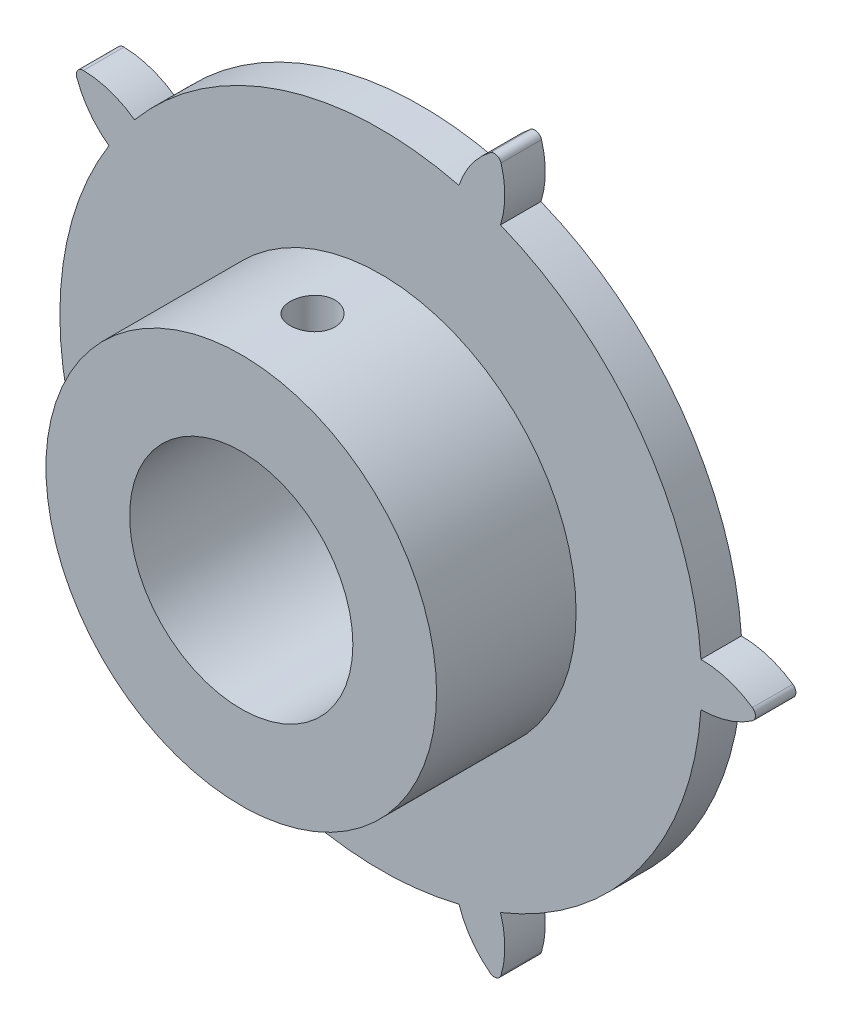
ISO-10303-21;
HEADER;
FILE_DESCRIPTION(('STEP AP214'),'2;1');
FILE_NAME('part.step','',(''),(''),'','','');
FILE_SCHEMA(('AUTOMOTIVE_DESIGN { 1 0 10303 214 1 1 1 1 }'));
ENDSEC;
DATA;
#1=APPLICATION_CONTEXT('core data for automotive mechanical design processes');
#2=APPLICATION_PROTOCOL_DEFINITION('international standard','automotive_design',2000,#1);
#3=PRODUCT_CONTEXT('',#1,'mechanical');
#4=PRODUCT('Part','Part','',(#3));
#5=PRODUCT_RELATED_PRODUCT_CATEGORY('part','',(#4));
#6=PRODUCT_DEFINITION_FORMATION('','',#4);
#7=PRODUCT_DEFINITION_CONTEXT('part definition',#1,'design');
#8=PRODUCT_DEFINITION('design','',#6,#7);
#9=PRODUCT_DEFINITION_SHAPE('','',#8);
#10=(LENGTH_UNIT() NAMED_UNIT(*) SI_UNIT(.MILLI.,.METRE.));
#11=(NAMED_UNIT(*) PLANE_ANGLE_UNIT() SI_UNIT($,.RADIAN.));
#12=(NAMED_UNIT(*) SI_UNIT($,.STERADIAN.) SOLID_ANGLE_UNIT());
#13=UNCERTAINTY_MEASURE_WITH_UNIT(LENGTH_MEASURE(1.E-05),#10,'distance_accuracy_value','');
#14=(GEOMETRIC_REPRESENTATION_CONTEXT(3) GLOBAL_UNCERTAINTY_ASSIGNED_CONTEXT((#13)) GLOBAL_UNIT_ASSIGNED_CONTEXT((#10,
#11,#12)) REPRESENTATION_CONTEXT('',''));
#15=CARTESIAN_POINT('',(0.,0.,0.));
#16=DIRECTION('',(0.,0.,1.));
#17=DIRECTION('',(1.,0.,0.));
#18=AXIS2_PLACEMENT_3D('',#15,#16,#17);
#19=CARTESIAN_POINT('',(0.,0.,1.45));
#20=DIRECTION('',(0.,0.,1.));
#21=DIRECTION('',(1.,0.,0.));
#22=AXIS2_PLACEMENT_3D('',#19,#20,#21);
#23=PLANE('',#22);
#24=CARTESIAN_POINT('',(0.,0.,1.45));
#25=DIRECTION('',(0.,0.,1.));
#26=DIRECTION('',(1.,0.,0.));
#27=AXIS2_PLACEMENT_3D('',#24,#25,#26);
#28=CIRCLE('',#27,11.5);
#29=CARTESIAN_POINT('',(11.4733978573661,0.78175546469862,1.45));
#30=VERTEX_POINT('',#29);
#31=CARTESIAN_POINT('',(4.28896855000234,10.6702740722575,1.45));
#32=VERTEX_POINT('',#31);
#33=EDGE_CURVE('E47',#30,#32,#28,.T.);
#34=ORIENTED_EDGE('',*,*,#33,.T.);
#35=CARTESIAN_POINT('',(1.18301199040116,11.6720902745467,1.45));
#36=DIRECTION('',(0.,0.,1.));
#37=DIRECTION('',(0.309016994374958,0.95105651629515,0.));
#38=AXIS2_PLACEMENT_3D('',#35,#36,#37);
#39=CIRCLE('',#38,3.26352598477457);
#40=CARTESIAN_POINT('',(4.31118696275242,12.6022102644695,1.45));
#41=VERTEX_POINT('',#40);
#42=EDGE_CURVE('E198',#32,#41,#39,.T.);
#43=ORIENTED_EDGE('',*,*,#42,.T.);
#44=CARTESIAN_POINT('',(4.07155542718742,12.5309591089508,1.45));
#45=DIRECTION('',(0.,0.,1.));
#46=DIRECTION('',(-0.309016994374958,-0.95105651629515,0.));
#47=AXIS2_PLACEMENT_3D('',#44,#45,#46);
#48=CIRCLE('',#47,0.25);
#49=CARTESIAN_POINT('',(3.9195698209499,12.7294543872236,1.45));
#50=VERTEX_POINT('',#49);
#51=EDGE_CURVE('E206',#41,#50,#48,.T.);
#52=ORIENTED_EDGE('',*,*,#51,.T.);
#53=CARTESIAN_POINT('',(5.90360572202134,10.1382763932297,1.45));
#54=DIRECTION('',(0.,0.,1.));
#55=DIRECTION('',(-0.309016994374958,-0.95105651629515,0.));
#56=AXIS2_PLACEMENT_3D('',#53,#54,#55);
#57=CIRCLE('',#56,3.26352598477458);
#58=CARTESIAN_POINT('',(2.8019812923004,11.1534255203322,1.45));
#59=VERTEX_POINT('',#58);
#60=EDGE_CURVE('E54',#50,#59,#57,.T.);
#61=ORIENTED_EDGE('',*,*,#60,.T.);
#62=CARTESIAN_POINT('',(-8.82266951678534,7.37634751063063,1.45));
#63=VERTEX_POINT('',#62);
#64=EDGE_CURVE('E315',#59,#63,#28,.T.);
#65=ORIENTED_EDGE('',*,*,#64,.T.);
#66=CARTESIAN_POINT('',(-10.7352467048097,4.73198551703978,1.45));
#67=DIRECTION('',(0.,0.,1.));
#68=DIRECTION('',(-0.809016994374942,0.58778525229248,0.));
#69=AXIS2_PLACEMENT_3D('',#66,#67,#68);
#70=CIRCLE('',#69,3.26352598477457);
#71=CARTESIAN_POINT('',(-10.6531841543272,7.99447959229986,1.45));
#72=VERTEX_POINT('',#71);
#73=EDGE_CURVE('E220',#63,#72,#70,.T.);
#74=ORIENTED_EDGE('',*,*,#73,.T.);
#75=CARTESIAN_POINT('',(-10.6594704954553,7.7445586409668,1.45));
#76=DIRECTION('',(0.,0.,1.));
#77=DIRECTION('',(0.809016994374942,-0.58778525229248,0.));
#78=AXIS2_PLACEMENT_3D('',#75,#76,#77);
#79=CIRCLE('',#78,0.25);
#80=CARTESIAN_POINT('',(-10.8952168585383,7.66135015406103,1.45));
#81=VERTEX_POINT('',#80);
#82=EDGE_CURVE('E215',#72,#81,#79,.T.);
#83=ORIENTED_EDGE('',*,*,#82,.T.);
#84=CARTESIAN_POINT('',(-7.81775933158866,8.74756239074405,1.45));
#85=DIRECTION('',(0.,0.,1.));
#86=DIRECTION('',(0.809016994374942,-0.58778525229248,0.));
#87=AXIS2_PLACEMENT_3D('',#84,#85,#86);
#88=CIRCLE('',#87,3.26352598477458);
#89=CARTESIAN_POINT('',(-9.74167818288316,6.11144059785729,1.45));
#90=VERTEX_POINT('',#89);
#91=EDGE_CURVE('E61',#81,#90,#88,.T.);
#92=ORIENTED_EDGE('',*,*,#91,.T.);
#93=CARTESIAN_POINT('',(-9.74167818288325,-6.11144059785715,1.45));
#94=VERTEX_POINT('',#93);
#95=EDGE_CURVE('E349',#90,#94,#28,.T.);
#96=ORIENTED_EDGE('',*,*,#95,.T.);
#97=CARTESIAN_POINT('',(-7.8177593315888,-8.74756239074393,1.45));
#98=DIRECTION('',(0.,0.,1.));
#99=DIRECTION('',(-0.809016994374951,-0.587785252292469,0.));
#100=AXIS2_PLACEMENT_3D('',#97,#98,#99);
#101=CIRCLE('',#100,3.26352598477457);
#102=CARTESIAN_POINT('',(-10.8952168585384,-7.66135015406087,1.45));
#103=VERTEX_POINT('',#102);
#104=EDGE_CURVE('E243',#94,#103,#101,.T.);
#105=ORIENTED_EDGE('',*,*,#104,.T.);
#106=CARTESIAN_POINT('',(-10.6594704954554,-7.74455864096665,1.45));
#107=DIRECTION('',(0.,0.,1.));
#108=DIRECTION('',(0.809016994374951,0.587785252292469,0.));
#109=AXIS2_PLACEMENT_3D('',#106,#107,#108);
#110=CIRCLE('',#109,0.25);
#111=CARTESIAN_POINT('',(-10.6531841543274,-7.99447959229971,1.45));
#112=VERTEX_POINT('',#111);
#113=EDGE_CURVE('E238',#103,#112,#110,.T.);
#114=ORIENTED_EDGE('',*,*,#113,.T.);
#115=CARTESIAN_POINT('',(-10.7352467048098,-4.73198551703962,1.45));
#116=DIRECTION('',(0.,0.,1.));
#117=DIRECTION('',(0.809016994374951,0.587785252292469,0.));
#118=AXIS2_PLACEMENT_3D('',#115,#116,#117);
#119=CIRCLE('',#118,3.26352598477458);
#120=CARTESIAN_POINT('',(-8.82266951678546,-7.37634751063049,1.45));
#121=VERTEX_POINT('',#120);
#122=EDGE_CURVE('E250',#112,#121,#119,.T.);
#123=ORIENTED_EDGE('',*,*,#122,.T.);
#124=CARTESIAN_POINT('',(2.80198129230024,-11.1534255203323,1.45));
#125=VERTEX_POINT('',#124);
#126=EDGE_CURVE('E321',#121,#125,#28,.T.);
#127=ORIENTED_EDGE('',*,*,#126,.T.);
#128=CARTESIAN_POINT('',(5.90360572202119,-10.1382763932298,1.45));
#129=DIRECTION('',(0.,0.,1.));
#130=DIRECTION('',(0.309016994374945,-0.951056516295155,0.));
#131=AXIS2_PLACEMENT_3D('',#128,#129,#130);
#132=CIRCLE('',#131,3.26352598477457);
#133=CARTESIAN_POINT('',(3.91956982094972,-12.7294543872237,1.45));
#134=VERTEX_POINT('',#133);
#135=EDGE_CURVE('E268',#125,#134,#132,.T.);
#136=ORIENTED_EDGE('',*,*,#135,.T.);
#137=CARTESIAN_POINT('',(4.07155542718724,-12.5309591089508,1.45));
#138=DIRECTION('',(0.,0.,1.));
#139=DIRECTION('',(-0.309016994374945,0.951056516295155,0.));
#140=AXIS2_PLACEMENT_3D('',#137,#138,#139);
#141=CIRCLE('',#140,0.25);
#142=CARTESIAN_POINT('',(4.31118696275224,-12.6022102644696,1.45));
#143=VERTEX_POINT('',#142);
#144=EDGE_CURVE('E263',#134,#143,#141,.T.);
#145=ORIENTED_EDGE('',*,*,#144,.T.);
#146=CARTESIAN_POINT('',(1.18301199040099,-11.6720902745468,1.45));
#147=DIRECTION('',(0.,0.,1.));
#148=DIRECTION('',(-0.309016994374945,0.951056516295155,0.));
#149=AXIS2_PLACEMENT_3D('',#146,#147,#148);
#150=CIRCLE('',#149,3.26352598477458);
#151=CARTESIAN_POINT('',(4.28896855000218,-10.6702740722576,1.45));
#152=VERTEX_POINT('',#151);
#153=EDGE_CURVE('E275',#143,#152,#150,.T.);
#154=ORIENTED_EDGE('',*,*,#153,.T.);
#155=CARTESIAN_POINT('',(11.4733978573661,-0.781755464698626,1.45));
#156=VERTEX_POINT('',#155);
#157=EDGE_CURVE('E316',#152,#156,#28,.T.);
#158=ORIENTED_EDGE('',*,*,#157,.T.);
#159=CARTESIAN_POINT('',(11.4663883239762,2.48176299238729,1.45));
#160=DIRECTION('',(0.,0.,1.));
#161=DIRECTION('',(1.,0.,0.));
#162=AXIS2_PLACEMENT_3D('',#159,#160,#161);
#163=CIRCLE('',#162,3.26352598477457);
#164=CARTESIAN_POINT('',(13.3176442291636,-0.205885315484757,1.45));
#165=VERTEX_POINT('',#164);
#166=EDGE_CURVE('E293',#156,#165,#163,.T.);
#167=ORIENTED_EDGE('',*,*,#166,.T.);
#168=CARTESIAN_POINT('',(13.1758301365362,0.,1.45));
#169=DIRECTION('',(0.,0.,1.));
#170=DIRECTION('',(-1.,0.,0.));
#171=AXIS2_PLACEMENT_3D('',#168,#169,#170);
#172=CIRCLE('',#171,0.25);
#173=CARTESIAN_POINT('',(13.3176442291636,0.205885315484755,1.45));
#174=VERTEX_POINT('',#173);
#175=EDGE_CURVE('E288',#165,#174,#172,.T.);
#176=ORIENTED_EDGE('',*,*,#175,.T.);
#177=CARTESIAN_POINT('',(11.4663883239762,-2.4817629923873,1.45));
#178=DIRECTION('',(0.,0.,1.));
#179=DIRECTION('',(-1.,0.,0.));
#180=AXIS2_PLACEMENT_3D('',#177,#178,#179);
#181=CIRCLE('',#180,3.26352598477458);
#182=EDGE_CURVE('E300',#174,#30,#181,.T.);
#183=ORIENTED_EDGE('',*,*,#182,.T.);
#184=EDGE_LOOP('',(#34,#43,#52,#61,#65,#74,#83,#92,#96,#105,#114,#123,#127,#136,#145,#154,#158,
#167,#176,#183));
#185=FACE_BOUND('',#184,.T.);
#186=CARTESIAN_POINT('',(0.,0.,1.45));
#187=DIRECTION('',(0.,0.,1.));
#188=DIRECTION('',(1.,0.,0.));
#189=AXIS2_PLACEMENT_3D('',#186,#187,#188);
#190=CIRCLE('',#189,7.);
#191=CARTESIAN_POINT('',(7.,0.,1.45));
#192=VERTEX_POINT('',#191);
#193=EDGE_CURVE('E387',#192,#192,#190,.T.);
#194=ORIENTED_EDGE('',*,*,#193,.F.);
#195=EDGE_LOOP('',(#194));
#196=FACE_BOUND('',#195,.T.);
#197=ADVANCED_FACE('F35',(#185,#196),#23,.T.);
#198=CARTESIAN_POINT('',(0.,0.,1.45));
#199=DIRECTION('',(0.,0.,-1.));
#200=DIRECTION('',(-1.,0.,0.));
#201=AXIS2_PLACEMENT_3D('',#198,#199,#200);
#202=CYLINDRICAL_SURFACE('',#201,11.5);
#203=CARTESIAN_POINT('',(0.,0.,0.));
#204=DIRECTION('',(0.,0.,1.));
#205=DIRECTION('',(1.,0.,0.));
#206=AXIS2_PLACEMENT_3D('',#203,#204,#205);
#207=CIRCLE('',#206,11.5);
#208=CARTESIAN_POINT('',(11.4733978573661,0.781755464698625,0.));
#209=VERTEX_POINT('',#208);
#210=CARTESIAN_POINT('',(4.28896855000234,10.6702740722575,0.));
#211=VERTEX_POINT('',#210);
#212=EDGE_CURVE('E317',#209,#211,#207,.T.);
#213=ORIENTED_EDGE('',*,*,#212,.T.);
#214=DIRECTION('',(0.,0.,1.));
#215=VECTOR('',#214,1.);
#216=CARTESIAN_POINT('',(4.28896855000234,10.6702740722575,0.725));
#217=LINE('',#216,#215);
#218=EDGE_CURVE('E212',#211,#32,#217,.T.);
#219=ORIENTED_EDGE('',*,*,#218,.T.);
#220=ORIENTED_EDGE('',*,*,#33,.F.);
#221=DIRECTION('',(0.,0.,1.));
#222=VECTOR('',#221,1.);
#223=CARTESIAN_POINT('',(11.4733978573661,0.781755464698625,0.725));
#224=LINE('',#223,#222);
#225=EDGE_CURVE('E306',#30,#209,#224,.F.);
#226=ORIENTED_EDGE('',*,*,#225,.T.);
#227=EDGE_LOOP('',(#213,#219,#220,#226));
#228=FACE_BOUND('',#227,.T.);
#229=ADVANCED_FACE('F363',(#228),#202,.T.);
#230=ORIENTED_EDGE('',*,*,#64,.F.);
#231=DIRECTION('',(0.,0.,1.));
#232=VECTOR('',#231,1.);
#233=CARTESIAN_POINT('',(2.8019812923004,11.1534255203322,0.725));
#234=LINE('',#233,#232);
#235=CARTESIAN_POINT('',(2.8019812923004,11.1534255203322,0.));
#236=VERTEX_POINT('',#235);
#237=EDGE_CURVE('E209',#59,#236,#234,.F.);
#238=ORIENTED_EDGE('',*,*,#237,.T.);
#239=CARTESIAN_POINT('',(-8.82266951678534,7.37634751063063,0.));
#240=VERTEX_POINT('',#239);
#241=EDGE_CURVE('E193',#236,#240,#207,.T.);
#242=ORIENTED_EDGE('',*,*,#241,.T.);
#243=DIRECTION('',(0.,0.,1.));
#244=VECTOR('',#243,1.);
#245=CARTESIAN_POINT('',(-8.82266951678534,7.37634751063063,0.725));
#246=LINE('',#245,#244);
#247=EDGE_CURVE('E235',#240,#63,#246,.T.);
#248=ORIENTED_EDGE('',*,*,#247,.T.);
#249=EDGE_LOOP('',(#230,#238,#242,#248));
#250=FACE_BOUND('',#249,.T.);
#251=ADVANCED_FACE('F364',(#250),#202,.T.);
#252=ORIENTED_EDGE('',*,*,#95,.F.);
#253=DIRECTION('',(0.,0.,1.));
#254=VECTOR('',#253,1.);
#255=CARTESIAN_POINT('',(-9.74167818288316,6.11144059785729,0.725));
#256=LINE('',#255,#254);
#257=CARTESIAN_POINT('',(-9.74167818288316,6.11144059785729,0.));
#258=VERTEX_POINT('',#257);
#259=EDGE_CURVE('E231',#90,#258,#256,.F.);
#260=ORIENTED_EDGE('',*,*,#259,.T.);
#261=CARTESIAN_POINT('',(-9.74167818288325,-6.11144059785715,0.));
#262=VERTEX_POINT('',#261);
#263=EDGE_CURVE('E322',#258,#262,#207,.T.);
#264=ORIENTED_EDGE('',*,*,#263,.T.);
#265=DIRECTION('',(0.,0.,1.));
#266=VECTOR('',#265,1.);
#267=CARTESIAN_POINT('',(-9.74167818288325,-6.11144059785715,0.725));
#268=LINE('',#267,#266);
#269=EDGE_CURVE('E260',#262,#94,#268,.T.);
#270=ORIENTED_EDGE('',*,*,#269,.T.);
#271=EDGE_LOOP('',(#252,#260,#264,#270));
#272=FACE_BOUND('',#271,.T.);
#273=ADVANCED_FACE('F334',(#272),#202,.T.);
#274=ORIENTED_EDGE('',*,*,#126,.F.);
#275=DIRECTION('',(0.,0.,1.));
#276=VECTOR('',#275,1.);
#277=CARTESIAN_POINT('',(-8.82266951678545,-7.3763475106305,0.725));
#278=LINE('',#277,#276);
#279=CARTESIAN_POINT('',(-8.82266951678545,-7.3763475106305,0.));
#280=VERTEX_POINT('',#279);
#281=EDGE_CURVE('E256',#121,#280,#278,.F.);
#282=ORIENTED_EDGE('',*,*,#281,.T.);
#283=CARTESIAN_POINT('',(2.80198129230024,-11.1534255203323,0.));
#284=VERTEX_POINT('',#283);
#285=EDGE_CURVE('E323',#280,#284,#207,.T.);
#286=ORIENTED_EDGE('',*,*,#285,.T.);
#287=DIRECTION('',(0.,0.,1.));
#288=VECTOR('',#287,1.);
#289=CARTESIAN_POINT('',(2.80198129230024,-11.1534255203323,0.725));
#290=LINE('',#289,#288);
#291=EDGE_CURVE('E285',#284,#125,#290,.T.);
#292=ORIENTED_EDGE('',*,*,#291,.T.);
#293=EDGE_LOOP('',(#274,#282,#286,#292));
#294=FACE_BOUND('',#293,.T.);
#295=ADVANCED_FACE('F357',(#294),#202,.T.);
#296=ORIENTED_EDGE('',*,*,#157,.F.);
#297=DIRECTION('',(0.,0.,1.));
#298=VECTOR('',#297,1.);
#299=CARTESIAN_POINT('',(4.28896855000219,-10.6702740722576,0.725));
#300=LINE('',#299,#298);
#301=CARTESIAN_POINT('',(4.28896855000219,-10.6702740722576,0.));
#302=VERTEX_POINT('',#301);
#303=EDGE_CURVE('E281',#152,#302,#300,.F.);
#304=ORIENTED_EDGE('',*,*,#303,.T.);
#305=CARTESIAN_POINT('',(11.4733978573661,-0.781755464698626,0.));
#306=VERTEX_POINT('',#305);
#307=EDGE_CURVE('E313',#302,#306,#207,.T.);
#308=ORIENTED_EDGE('',*,*,#307,.T.);
#309=DIRECTION('',(0.,0.,1.));
#310=VECTOR('',#309,1.);
#311=CARTESIAN_POINT('',(11.4733978573661,-0.781755464698627,0.725));
#312=LINE('',#311,#310);
#313=EDGE_CURVE('E310',#306,#156,#312,.T.);
#314=ORIENTED_EDGE('',*,*,#313,.T.);
#315=EDGE_LOOP('',(#296,#304,#308,#314));
#316=FACE_BOUND('',#315,.T.);
#317=ADVANCED_FACE('F37',(#316),#202,.T.);
#318=CARTESIAN_POINT('',(0.,0.,0.));
#319=DIRECTION('',(0.,0.,1.));
#320=DIRECTION('',(1.,0.,0.));
#321=AXIS2_PLACEMENT_3D('',#318,#319,#320);
#322=PLANE('',#321);
#323=CARTESIAN_POINT('',(0.,0.,0.));
#324=DIRECTION('',(0.,0.,1.));
#325=DIRECTION('',(1.,0.,0.));
#326=AXIS2_PLACEMENT_3D('',#323,#324,#325);
#327=CIRCLE('',#326,4.);
#328=CARTESIAN_POINT('',(4.,0.,0.));
#329=VERTEX_POINT('',#328);
#330=EDGE_CURVE('E202',#329,#329,#327,.T.);
#331=ORIENTED_EDGE('',*,*,#330,.T.);
#332=EDGE_LOOP('',(#331));
#333=FACE_BOUND('',#332,.T.);
#334=ORIENTED_EDGE('',*,*,#241,.F.);
#335=CARTESIAN_POINT('',(5.90360572202134,10.1382763932297,0.));
#336=DIRECTION('',(0.,0.,1.));
#337=DIRECTION('',(-0.309016994374958,-0.95105651629515,0.));
#338=AXIS2_PLACEMENT_3D('',#335,#336,#337);
#339=CIRCLE('',#338,3.26352598477458);
#340=CARTESIAN_POINT('',(3.9195698209499,12.7294543872236,0.));
#341=VERTEX_POINT('',#340);
#342=EDGE_CURVE('E178',#341,#236,#339,.T.);
#343=ORIENTED_EDGE('',*,*,#342,.F.);
#344=CARTESIAN_POINT('',(4.07155542718742,12.5309591089508,0.));
#345=DIRECTION('',(0.,0.,1.));
#346=DIRECTION('',(-0.309016994374958,-0.95105651629515,0.));
#347=AXIS2_PLACEMENT_3D('',#344,#345,#346);
#348=CIRCLE('',#347,0.25);
#349=CARTESIAN_POINT('',(4.31118696275242,12.6022102644695,0.));
#350=VERTEX_POINT('',#349);
#351=EDGE_CURVE('E191',#350,#341,#348,.T.);
#352=ORIENTED_EDGE('',*,*,#351,.F.);
#353=CARTESIAN_POINT('',(1.18301199040116,11.6720902745467,0.));
#354=DIRECTION('',(0.,0.,1.));
#355=DIRECTION('',(0.309016994374958,0.95105651629515,0.));
#356=AXIS2_PLACEMENT_3D('',#353,#354,#355);
#357=CIRCLE('',#356,3.26352598477457);
#358=EDGE_CURVE('E184',#211,#350,#357,.T.);
#359=ORIENTED_EDGE('',*,*,#358,.F.);
#360=ORIENTED_EDGE('',*,*,#212,.F.);
#361=CARTESIAN_POINT('',(11.4663883239762,-2.4817629923873,0.));
#362=DIRECTION('',(0.,0.,1.));
#363=DIRECTION('',(-1.,0.,0.));
#364=AXIS2_PLACEMENT_3D('',#361,#362,#363);
#365=CIRCLE('',#364,3.26352598477458);
#366=CARTESIAN_POINT('',(13.3176442291636,0.205885315484755,0.));
#367=VERTEX_POINT('',#366);
#368=EDGE_CURVE('E292',#367,#209,#365,.T.);
#369=ORIENTED_EDGE('',*,*,#368,.F.);
#370=CARTESIAN_POINT('',(13.1758301365362,0.,0.));
#371=DIRECTION('',(0.,0.,1.));
#372=DIRECTION('',(-1.,0.,0.));
#373=AXIS2_PLACEMENT_3D('',#370,#371,#372);
#374=CIRCLE('',#373,0.25);
#375=CARTESIAN_POINT('',(13.3176442291636,-0.205885315484757,0.));
#376=VERTEX_POINT('',#375);
#377=EDGE_CURVE('E289',#376,#367,#374,.T.);
#378=ORIENTED_EDGE('',*,*,#377,.F.);
#379=CARTESIAN_POINT('',(11.4663883239762,2.48176299238729,0.));
#380=DIRECTION('',(0.,0.,1.));
#381=DIRECTION('',(1.,0.,0.));
#382=AXIS2_PLACEMENT_3D('',#379,#380,#381);
#383=CIRCLE('',#382,3.26352598477457);
#384=EDGE_CURVE('E295',#306,#376,#383,.T.);
#385=ORIENTED_EDGE('',*,*,#384,.F.);
#386=ORIENTED_EDGE('',*,*,#307,.F.);
#387=CARTESIAN_POINT('',(1.18301199040099,-11.6720902745468,0.));
#388=DIRECTION('',(0.,0.,1.));
#389=DIRECTION('',(-0.309016994374945,0.951056516295155,0.));
#390=AXIS2_PLACEMENT_3D('',#387,#388,#389);
#391=CIRCLE('',#390,3.26352598477458);
#392=CARTESIAN_POINT('',(4.31118696275224,-12.6022102644696,0.));
#393=VERTEX_POINT('',#392);
#394=EDGE_CURVE('E267',#393,#302,#391,.T.);
#395=ORIENTED_EDGE('',*,*,#394,.F.);
#396=CARTESIAN_POINT('',(4.07155542718724,-12.5309591089508,0.));
#397=DIRECTION('',(0.,0.,1.));
#398=DIRECTION('',(-0.309016994374945,0.951056516295155,0.));
#399=AXIS2_PLACEMENT_3D('',#396,#397,#398);
#400=CIRCLE('',#399,0.25);
#401=CARTESIAN_POINT('',(3.91956982094972,-12.7294543872237,0.));
#402=VERTEX_POINT('',#401);
#403=EDGE_CURVE('E264',#402,#393,#400,.T.);
#404=ORIENTED_EDGE('',*,*,#403,.F.);
#405=CARTESIAN_POINT('',(5.90360572202119,-10.1382763932298,0.));
#406=DIRECTION('',(0.,0.,1.));
#407=DIRECTION('',(0.309016994374945,-0.951056516295155,0.));
#408=AXIS2_PLACEMENT_3D('',#405,#406,#407);
#409=CIRCLE('',#408,3.26352598477457);
#410=EDGE_CURVE('E270',#284,#402,#409,.T.);
#411=ORIENTED_EDGE('',*,*,#410,.F.);
#412=ORIENTED_EDGE('',*,*,#285,.F.);
#413=CARTESIAN_POINT('',(-10.7352467048098,-4.73198551703962,0.));
#414=DIRECTION('',(0.,0.,1.));
#415=DIRECTION('',(0.809016994374951,0.587785252292469,0.));
#416=AXIS2_PLACEMENT_3D('',#413,#414,#415);
#417=CIRCLE('',#416,3.26352598477458);
#418=CARTESIAN_POINT('',(-10.6531841543274,-7.99447959229971,0.));
#419=VERTEX_POINT('',#418);
#420=EDGE_CURVE('E242',#419,#280,#417,.T.);
#421=ORIENTED_EDGE('',*,*,#420,.F.);
#422=CARTESIAN_POINT('',(-10.6594704954554,-7.74455864096665,0.));
#423=DIRECTION('',(0.,0.,1.));
#424=DIRECTION('',(0.809016994374951,0.587785252292469,0.));
#425=AXIS2_PLACEMENT_3D('',#422,#423,#424);
#426=CIRCLE('',#425,0.25);
#427=CARTESIAN_POINT('',(-10.8952168585384,-7.66135015406087,0.));
#428=VERTEX_POINT('',#427);
#429=EDGE_CURVE('E239',#428,#419,#426,.T.);
#430=ORIENTED_EDGE('',*,*,#429,.F.);
#431=CARTESIAN_POINT('',(-7.8177593315888,-8.74756239074393,0.));
#432=DIRECTION('',(0.,0.,1.));
#433=DIRECTION('',(-0.809016994374951,-0.587785252292469,0.));
#434=AXIS2_PLACEMENT_3D('',#431,#432,#433);
#435=CIRCLE('',#434,3.26352598477457);
#436=EDGE_CURVE('E245',#262,#428,#435,.T.);
#437=ORIENTED_EDGE('',*,*,#436,.F.);
#438=ORIENTED_EDGE('',*,*,#263,.F.);
#439=CARTESIAN_POINT('',(-7.81775933158866,8.74756239074405,0.));
#440=DIRECTION('',(0.,0.,1.));
#441=DIRECTION('',(0.809016994374942,-0.58778525229248,0.));
#442=AXIS2_PLACEMENT_3D('',#439,#440,#441);
#443=CIRCLE('',#442,3.26352598477458);
#444=CARTESIAN_POINT('',(-10.8952168585383,7.66135015406103,0.));
#445=VERTEX_POINT('',#444);
#446=EDGE_CURVE('E219',#445,#258,#443,.T.);
#447=ORIENTED_EDGE('',*,*,#446,.F.);
#448=CARTESIAN_POINT('',(-10.6594704954553,7.7445586409668,0.));
#449=DIRECTION('',(0.,0.,1.));
#450=DIRECTION('',(0.809016994374942,-0.58778525229248,0.));
#451=AXIS2_PLACEMENT_3D('',#448,#449,#450);
#452=CIRCLE('',#451,0.25);
#453=CARTESIAN_POINT('',(-10.6531841543272,7.99447959229986,0.));
#454=VERTEX_POINT('',#453);
#455=EDGE_CURVE('E216',#454,#445,#452,.T.);
#456=ORIENTED_EDGE('',*,*,#455,.F.);
#457=CARTESIAN_POINT('',(-10.7352467048097,4.73198551703978,0.));
#458=DIRECTION('',(0.,0.,1.));
#459=DIRECTION('',(-0.809016994374942,0.58778525229248,0.));
#460=AXIS2_PLACEMENT_3D('',#457,#458,#459);
#461=CIRCLE('',#460,3.26352598477457);
#462=EDGE_CURVE('E222',#240,#454,#461,.T.);
#463=ORIENTED_EDGE('',*,*,#462,.F.);
#464=EDGE_LOOP('',(#334,#343,#352,#359,#360,#369,#378,#385,#386,#395,#404,#411,#412,#421,#430,
#437,#438,#447,#456,#463));
#465=FACE_BOUND('',#464,.T.);
#466=ADVANCED_FACE('F189',(#333,#465),#322,.F.);
#467=CARTESIAN_POINT('',(11.4663883239762,2.48176299238729,0.));
#468=DIRECTION('',(0.,0.,1.));
#469=DIRECTION('',(1.,0.,0.));
#470=AXIS2_PLACEMENT_3D('',#467,#468,#469);
#471=CYLINDRICAL_SURFACE('',#470,3.26352598477457);
#472=ORIENTED_EDGE('',*,*,#313,.F.);
#473=ORIENTED_EDGE('',*,*,#384,.T.);
#474=DIRECTION('',(0.,0.,1.));
#475=VECTOR('',#474,1.);
#476=CARTESIAN_POINT('',(13.3176442291636,-0.205885315484757,0.));
#477=LINE('',#476,#475);
#478=EDGE_CURVE('E303',#376,#165,#477,.T.);
#479=ORIENTED_EDGE('',*,*,#478,.T.);
#480=ORIENTED_EDGE('',*,*,#166,.F.);
#481=EDGE_LOOP('',(#472,#473,#479,#480));
#482=FACE_BOUND('',#481,.T.);
#483=ADVANCED_FACE('F374',(#482),#471,.T.);
#484=CARTESIAN_POINT('',(11.4663883239762,-2.4817629923873,0.));
#485=DIRECTION('',(0.,0.,1.));
#486=DIRECTION('',(1.,0.,0.));
#487=AXIS2_PLACEMENT_3D('',#484,#485,#486);
#488=CYLINDRICAL_SURFACE('',#487,3.26352598477458);
#489=ORIENTED_EDGE('',*,*,#225,.F.);
#490=ORIENTED_EDGE('',*,*,#182,.F.);
#491=DIRECTION('',(0.,0.,1.));
#492=VECTOR('',#491,1.);
#493=CARTESIAN_POINT('',(13.3176442291636,0.205885315484755,0.));
#494=LINE('',#493,#492);
#495=EDGE_CURVE('E297',#367,#174,#494,.T.);
#496=ORIENTED_EDGE('',*,*,#495,.F.);
#497=ORIENTED_EDGE('',*,*,#368,.T.);
#498=EDGE_LOOP('',(#489,#490,#496,#497));
#499=FACE_BOUND('',#498,.T.);
#500=ADVANCED_FACE('F379',(#499),#488,.T.);
#501=CARTESIAN_POINT('',(13.1758301365362,0.,0.));
#502=DIRECTION('',(0.,0.,1.));
#503=DIRECTION('',(1.,0.,0.));
#504=AXIS2_PLACEMENT_3D('',#501,#502,#503);
#505=CYLINDRICAL_SURFACE('',#504,0.25);
#506=ORIENTED_EDGE('',*,*,#175,.F.);
#507=ORIENTED_EDGE('',*,*,#478,.F.);
#508=ORIENTED_EDGE('',*,*,#377,.T.);
#509=ORIENTED_EDGE('',*,*,#495,.T.);
#510=EDGE_LOOP('',(#506,#507,#508,#509));
#511=FACE_BOUND('',#510,.T.);
#512=ADVANCED_FACE('F371',(#511),#505,.T.);
#513=CARTESIAN_POINT('',(5.90360572202119,-10.1382763932298,0.));
#514=DIRECTION('',(0.,0.,1.));
#515=DIRECTION('',(1.,0.,0.));
#516=AXIS2_PLACEMENT_3D('',#513,#514,#515);
#517=CYLINDRICAL_SURFACE('',#516,3.26352598477457);
#518=ORIENTED_EDGE('',*,*,#291,.F.);
#519=ORIENTED_EDGE('',*,*,#410,.T.);
#520=DIRECTION('',(0.,0.,1.));
#521=VECTOR('',#520,1.);
#522=CARTESIAN_POINT('',(3.91956982094972,-12.7294543872237,0.));
#523=LINE('',#522,#521);
#524=EDGE_CURVE('E278',#402,#134,#523,.T.);
#525=ORIENTED_EDGE('',*,*,#524,.T.);
#526=ORIENTED_EDGE('',*,*,#135,.F.);
#527=EDGE_LOOP('',(#518,#519,#525,#526));
#528=FACE_BOUND('',#527,.T.);
#529=ADVANCED_FACE('F353',(#528),#517,.T.);
#530=CARTESIAN_POINT('',(1.18301199040099,-11.6720902745468,0.));
#531=DIRECTION('',(0.,0.,1.));
#532=DIRECTION('',(1.,0.,0.));
#533=AXIS2_PLACEMENT_3D('',#530,#531,#532);
#534=CYLINDRICAL_SURFACE('',#533,3.26352598477458);
#535=ORIENTED_EDGE('',*,*,#303,.F.);
#536=ORIENTED_EDGE('',*,*,#153,.F.);
#537=DIRECTION('',(0.,0.,1.));
#538=VECTOR('',#537,1.);
#539=CARTESIAN_POINT('',(4.31118696275224,-12.6022102644696,0.));
#540=LINE('',#539,#538);
#541=EDGE_CURVE('E272',#393,#143,#540,.T.);
#542=ORIENTED_EDGE('',*,*,#541,.F.);
#543=ORIENTED_EDGE('',*,*,#394,.T.);
#544=EDGE_LOOP('',(#535,#536,#542,#543));
#545=FACE_BOUND('',#544,.T.);
#546=ADVANCED_FACE('F462',(#545),#534,.T.);
#547=CARTESIAN_POINT('',(4.07155542718724,-12.5309591089508,0.));
#548=DIRECTION('',(0.,0.,1.));
#549=DIRECTION('',(1.,0.,0.));
#550=AXIS2_PLACEMENT_3D('',#547,#548,#549);
#551=CYLINDRICAL_SURFACE('',#550,0.25);
#552=ORIENTED_EDGE('',*,*,#144,.F.);
#553=ORIENTED_EDGE('',*,*,#524,.F.);
#554=ORIENTED_EDGE('',*,*,#403,.T.);
#555=ORIENTED_EDGE('',*,*,#541,.T.);
#556=EDGE_LOOP('',(#552,#553,#554,#555));
#557=FACE_BOUND('',#556,.T.);
#558=ADVANCED_FACE('F454',(#557),#551,.T.);
#559=CARTESIAN_POINT('',(-7.8177593315888,-8.74756239074393,0.));
#560=DIRECTION('',(0.,0.,1.));
#561=DIRECTION('',(1.,0.,0.));
#562=AXIS2_PLACEMENT_3D('',#559,#560,#561);
#563=CYLINDRICAL_SURFACE('',#562,3.26352598477457);
#564=ORIENTED_EDGE('',*,*,#269,.F.);
#565=ORIENTED_EDGE('',*,*,#436,.T.);
#566=DIRECTION('',(0.,0.,1.));
#567=VECTOR('',#566,1.);
#568=CARTESIAN_POINT('',(-10.8952168585384,-7.66135015406087,0.));
#569=LINE('',#568,#567);
#570=EDGE_CURVE('E253',#428,#103,#569,.T.);
#571=ORIENTED_EDGE('',*,*,#570,.T.);
#572=ORIENTED_EDGE('',*,*,#104,.F.);
#573=EDGE_LOOP('',(#564,#565,#571,#572));
#574=FACE_BOUND('',#573,.T.);
#575=ADVANCED_FACE('F339',(#574),#563,.T.);
#576=CARTESIAN_POINT('',(-10.7352467048098,-4.73198551703962,0.));
#577=DIRECTION('',(0.,0.,1.));
#578=DIRECTION('',(1.,0.,0.));
#579=AXIS2_PLACEMENT_3D('',#576,#577,#578);
#580=CYLINDRICAL_SURFACE('',#579,3.26352598477458);
#581=ORIENTED_EDGE('',*,*,#281,.F.);
#582=ORIENTED_EDGE('',*,*,#122,.F.);
#583=DIRECTION('',(0.,0.,1.));
#584=VECTOR('',#583,1.);
#585=CARTESIAN_POINT('',(-10.6531841543274,-7.99447959229971,0.));
#586=LINE('',#585,#584);
#587=EDGE_CURVE('E247',#419,#112,#586,.T.);
#588=ORIENTED_EDGE('',*,*,#587,.F.);
#589=ORIENTED_EDGE('',*,*,#420,.T.);
#590=EDGE_LOOP('',(#581,#582,#588,#589));
#591=FACE_BOUND('',#590,.T.);
#592=ADVANCED_FACE('F453',(#591),#580,.T.);
#593=CARTESIAN_POINT('',(-10.6594704954554,-7.74455864096665,0.));
#594=DIRECTION('',(0.,0.,1.));
#595=DIRECTION('',(1.,0.,0.));
#596=AXIS2_PLACEMENT_3D('',#593,#594,#595);
#597=CYLINDRICAL_SURFACE('',#596,0.25);
#598=ORIENTED_EDGE('',*,*,#113,.F.);
#599=ORIENTED_EDGE('',*,*,#570,.F.);
#600=ORIENTED_EDGE('',*,*,#429,.T.);
#601=ORIENTED_EDGE('',*,*,#587,.T.);
#602=EDGE_LOOP('',(#598,#599,#600,#601));
#603=FACE_BOUND('',#602,.T.);
#604=ADVANCED_FACE('F345',(#603),#597,.T.);
#605=CARTESIAN_POINT('',(-10.7352467048097,4.73198551703978,0.));
#606=DIRECTION('',(0.,0.,1.));
#607=DIRECTION('',(1.,0.,0.));
#608=AXIS2_PLACEMENT_3D('',#605,#606,#607);
#609=CYLINDRICAL_SURFACE('',#608,3.26352598477457);
#610=ORIENTED_EDGE('',*,*,#247,.F.);
#611=ORIENTED_EDGE('',*,*,#462,.T.);
#612=DIRECTION('',(0.,0.,1.));
#613=VECTOR('',#612,1.);
#614=CARTESIAN_POINT('',(-10.6531841543272,7.99447959229986,0.));
#615=LINE('',#614,#613);
#616=EDGE_CURVE('E228',#454,#72,#615,.T.);
#617=ORIENTED_EDGE('',*,*,#616,.T.);
#618=ORIENTED_EDGE('',*,*,#73,.F.);
#619=EDGE_LOOP('',(#610,#611,#617,#618));
#620=FACE_BOUND('',#619,.T.);
#621=ADVANCED_FACE('F439',(#620),#609,.T.);
#622=CARTESIAN_POINT('',(-7.81775933158866,8.74756239074405,0.));
#623=DIRECTION('',(0.,0.,1.));
#624=DIRECTION('',(1.,0.,0.));
#625=AXIS2_PLACEMENT_3D('',#622,#623,#624);
#626=CYLINDRICAL_SURFACE('',#625,3.26352598477458);
#627=ORIENTED_EDGE('',*,*,#259,.F.);
#628=ORIENTED_EDGE('',*,*,#91,.F.);
#629=DIRECTION('',(0.,0.,1.));
#630=VECTOR('',#629,1.);
#631=CARTESIAN_POINT('',(-10.8952168585383,7.66135015406103,0.));
#632=LINE('',#631,#630);
#633=EDGE_CURVE('E224',#445,#81,#632,.T.);
#634=ORIENTED_EDGE('',*,*,#633,.F.);
#635=ORIENTED_EDGE('',*,*,#446,.T.);
#636=EDGE_LOOP('',(#627,#628,#634,#635));
#637=FACE_BOUND('',#636,.T.);
#638=ADVANCED_FACE('F442',(#637),#626,.T.);
#639=CARTESIAN_POINT('',(-10.6594704954553,7.7445586409668,0.));
#640=DIRECTION('',(0.,0.,1.));
#641=DIRECTION('',(1.,0.,0.));
#642=AXIS2_PLACEMENT_3D('',#639,#640,#641);
#643=CYLINDRICAL_SURFACE('',#642,0.25);
#644=ORIENTED_EDGE('',*,*,#82,.F.);
#645=ORIENTED_EDGE('',*,*,#616,.F.);
#646=ORIENTED_EDGE('',*,*,#455,.T.);
#647=ORIENTED_EDGE('',*,*,#633,.T.);
#648=EDGE_LOOP('',(#644,#645,#646,#647));
#649=FACE_BOUND('',#648,.T.);
#650=ADVANCED_FACE('F446',(#649),#643,.T.);
#651=CARTESIAN_POINT('',(1.18301199040116,11.6720902745467,0.));
#652=DIRECTION('',(0.,0.,1.));
#653=DIRECTION('',(1.,0.,0.));
#654=AXIS2_PLACEMENT_3D('',#651,#652,#653);
#655=CYLINDRICAL_SURFACE('',#654,3.26352598477457);
#656=ORIENTED_EDGE('',*,*,#218,.F.);
#657=ORIENTED_EDGE('',*,*,#358,.T.);
#658=DIRECTION('',(0.,0.,1.));
#659=VECTOR('',#658,1.);
#660=CARTESIAN_POINT('',(4.31118696275242,12.6022102644695,0.));
#661=LINE('',#660,#659);
#662=EDGE_CURVE('E183',#350,#41,#661,.T.);
#663=ORIENTED_EDGE('',*,*,#662,.T.);
#664=ORIENTED_EDGE('',*,*,#42,.F.);
#665=EDGE_LOOP('',(#656,#657,#663,#664));
#666=FACE_BOUND('',#665,.T.);
#667=ADVANCED_FACE('F436',(#666),#655,.T.);
#668=CARTESIAN_POINT('',(5.90360572202134,10.1382763932297,0.));
#669=DIRECTION('',(0.,0.,1.));
#670=DIRECTION('',(1.,0.,0.));
#671=AXIS2_PLACEMENT_3D('',#668,#669,#670);
#672=CYLINDRICAL_SURFACE('',#671,3.26352598477458);
#673=ORIENTED_EDGE('',*,*,#237,.F.);
#674=ORIENTED_EDGE('',*,*,#60,.F.);
#675=DIRECTION('',(0.,0.,1.));
#676=VECTOR('',#675,1.);
#677=CARTESIAN_POINT('',(3.9195698209499,12.7294543872236,0.));
#678=LINE('',#677,#676);
#679=EDGE_CURVE('E175',#341,#50,#678,.T.);
#680=ORIENTED_EDGE('',*,*,#679,.F.);
#681=ORIENTED_EDGE('',*,*,#342,.T.);
#682=EDGE_LOOP('',(#673,#674,#680,#681));
#683=FACE_BOUND('',#682,.T.);
#684=ADVANCED_FACE('F177',(#683),#672,.T.);
#685=CARTESIAN_POINT('',(4.07155542718742,12.5309591089508,0.));
#686=DIRECTION('',(0.,0.,1.));
#687=DIRECTION('',(1.,0.,0.));
#688=AXIS2_PLACEMENT_3D('',#685,#686,#687);
#689=CYLINDRICAL_SURFACE('',#688,0.25);
#690=ORIENTED_EDGE('',*,*,#51,.F.);
#691=ORIENTED_EDGE('',*,*,#662,.F.);
#692=ORIENTED_EDGE('',*,*,#351,.T.);
#693=ORIENTED_EDGE('',*,*,#679,.T.);
#694=EDGE_LOOP('',(#690,#691,#692,#693));
#695=FACE_BOUND('',#694,.T.);
#696=ADVANCED_FACE('F196',(#695),#689,.T.);
#697=CARTESIAN_POINT('',(0.,0.,0.));
#698=DIRECTION('',(0.,0.,1.));
#699=DIRECTION('',(1.,0.,0.));
#700=AXIS2_PLACEMENT_3D('',#697,#698,#699);
#701=CYLINDRICAL_SURFACE('',#700,4.);
#702=CARTESIAN_POINT('',(-0.812299426563515,3.91665286202449,3.87491846005935));
#703=CARTESIAN_POINT('',(-0.812297786047243,3.91665375107726,3.91936996044493));
#704=CARTESIAN_POINT('',(-0.80858438216281,3.91742900669207,3.96384215870455));
#705=CARTESIAN_POINT('',(-0.793841059764069,3.92044268909263,4.05152846415408));
#706=CARTESIAN_POINT('',(-0.782805286868832,3.92268228662822,4.0947415357642));
#707=CARTESIAN_POINT('',(-0.753772528833938,3.92836405251268,4.17862830274969));
#708=CARTESIAN_POINT('',(-0.735782467548941,3.93180502441584,4.21930447728729));
#709=CARTESIAN_POINT('',(-0.693369866084434,3.93950513385996,4.29705833581504));
#710=CARTESIAN_POINT('',(-0.668947684919839,3.94376422573319,4.33413622048916));
#711=CARTESIAN_POINT('',(-0.613994853930101,3.95269437995513,4.40416726314294));
#712=CARTESIAN_POINT('',(-0.583390645307456,3.95736998296761,4.43706213036666));
#713=CARTESIAN_POINT('',(-0.517100125327748,3.96657600778413,4.49728448692239));
#714=CARTESIAN_POINT('',(-0.481413458023775,3.97110641939255,4.52461158599306));
#715=CARTESIAN_POINT('',(-0.405584017036043,3.97956874369873,4.57314887416215));
#716=CARTESIAN_POINT('',(-0.365405114324086,3.98349509559176,4.59430367111266));
#717=CARTESIAN_POINT('',(-0.281971232511764,3.99026837383983,4.62953840969784));
#718=CARTESIAN_POINT('',(-0.238716541782933,3.99311540122927,4.64361901358013));
#719=CARTESIAN_POINT('',(-0.150963036792561,3.99738834922992,4.66412421495504));
#720=CARTESIAN_POINT('',(-0.106488123966932,3.99883249982512,4.67064724211615));
#721=CARTESIAN_POINT('',(-0.0170526821301932,4.0002135476364,4.67615922152999));
#722=CARTESIAN_POINT('',(0.0279077996693639,4.00015059009208,4.675148899776));
#723=CARTESIAN_POINT('',(0.116361657733914,3.99854847231121,4.6656975158869));
#724=CARTESIAN_POINT('',(0.159866808752201,3.99703034714818,4.65736247832506));
#725=CARTESIAN_POINT('',(0.244852270634775,3.99272574844732,4.63366643409223));
#726=CARTESIAN_POINT('',(0.286332500409875,3.98993922416175,4.61830514630584));
#727=CARTESIAN_POINT('',(0.36639245188984,3.983388200552,4.58089442794153));
#728=CARTESIAN_POINT('',(0.404952247413717,3.97961764875619,4.55880345917543));
#729=CARTESIAN_POINT('',(0.477858713896234,3.97152345221531,4.50859119827006));
#730=CARTESIAN_POINT('',(0.51220489935012,3.96719974385091,4.48046921224293));
#731=CARTESIAN_POINT('',(0.576337516337319,3.9583964980345,4.41841156237257));
#732=CARTESIAN_POINT('',(0.606034037956105,3.95391555804628,4.38438311067567));
#733=CARTESIAN_POINT('',(0.659312431611308,3.94538177229509,4.31178530609874));
#734=CARTESIAN_POINT('',(0.682894187996087,3.94132893462989,4.27321586735279));
#735=CARTESIAN_POINT('',(0.723303575504015,3.93411440913411,4.1925017946019));
#736=CARTESIAN_POINT('',(0.740116644072172,3.93095464702155,4.15034968594762));
#737=CARTESIAN_POINT('',(0.766391542945739,3.92591706421618,4.06374140108016));
#738=CARTESIAN_POINT('',(0.775854331344368,3.92403907645071,4.01928552596408));
#739=CARTESIAN_POINT('',(0.787025057260576,3.92181384170615,3.93014657366011));
#740=CARTESIAN_POINT('',(0.788862919207832,3.92144095172499,3.88548040061108));
#741=CARTESIAN_POINT('',(0.78508113389861,3.92219979247926,3.7964798814996));
#742=CARTESIAN_POINT('',(0.779461909520647,3.9233314378951,3.75214551676426));
#743=CARTESIAN_POINT('',(0.761037778638072,3.92694631177468,3.66550354782556));
#744=CARTESIAN_POINT('',(0.748302291587802,3.92941647599306,3.62318058563074));
#745=CARTESIAN_POINT('',(0.716082032541796,3.93541528021362,3.54126783683636));
#746=CARTESIAN_POINT('',(0.69659670455807,3.93894400740698,3.50167827571078));
#747=CARTESIAN_POINT('',(0.651136725862446,3.94671478803635,3.42578797209923));
#748=CARTESIAN_POINT('',(0.625080801835613,3.95096553967008,3.3895368230187));
#749=CARTESIAN_POINT('',(0.567328786070563,3.95967029918775,3.32187181045863));
#750=CARTESIAN_POINT('',(0.535632113839142,3.96412432795597,3.29045844545995));
#751=CARTESIAN_POINT('',(0.466916409175113,3.97280811887926,3.2328684127109));
#752=CARTESIAN_POINT('',(0.429823142487521,3.97703338870096,3.20677953633936));
#753=CARTESIAN_POINT('',(0.351707005803219,3.98470075833442,3.16120175485969));
#754=CARTESIAN_POINT('',(0.310684300924371,3.98814289103366,3.14171257258354));
#755=CARTESIAN_POINT('',(0.226105561899876,3.99382783814377,3.11001536266205));
#756=CARTESIAN_POINT('',(0.1825654793566,3.99607744588265,3.09776604547836));
#757=CARTESIAN_POINT('',(0.0939976515941027,3.99914067716822,3.08076546192829));
#758=CARTESIAN_POINT('',(0.0489700862196422,3.99995447366967,3.07601329247882));
#759=CARTESIAN_POINT('',(-0.0404557162507217,4.00004103254866,3.07417687528905));
#760=CARTESIAN_POINT('',(-0.0848512700152047,3.99934036430591,3.07696063569439));
#761=CARTESIAN_POINT('',(-0.172523818593849,3.99651844284111,3.08982562049761));
#762=CARTESIAN_POINT('',(-0.215800827465586,3.99439720748138,3.09990675313782));
#763=CARTESIAN_POINT('',(-0.299926099708421,3.98896209410944,3.12702165373268));
#764=CARTESIAN_POINT('',(-0.340779661205658,3.98565093856877,3.14403956256431));
#765=CARTESIAN_POINT('',(-0.419067620941277,3.97818181386255,3.18452825312408));
#766=CARTESIAN_POINT('',(-0.45650174867305,3.97402377778536,3.20799954478233));
#767=CARTESIAN_POINT('',(-0.527541614076281,3.96522423732802,3.26117396970903));
#768=CARTESIAN_POINT('',(-0.561075848109918,3.9605760155821,3.29097152916878));
#769=CARTESIAN_POINT('',(-0.622713523982631,3.95135438879583,3.35575865213598));
#770=CARTESIAN_POINT('',(-0.65081567772434,3.94678100173564,3.39074944363435));
#771=CARTESIAN_POINT('',(-0.701080187308021,3.93816526859954,3.4653819134195));
#772=CARTESIAN_POINT('',(-0.723175301943787,3.93412917327085,3.50506962898765));
#773=CARTESIAN_POINT('',(-0.760351251284189,3.92711430185276,3.58766467869911));
#774=CARTESIAN_POINT('',(-0.77543844879349,3.92413456723016,3.63056905101769));
#775=CARTESIAN_POINT('',(-0.795245665128262,3.9201602762173,3.70712842440861));
#776=CARTESIAN_POINT('',(-0.801629399816239,3.91885305981431,3.74034679566852));
#777=CARTESIAN_POINT('',(-0.810156831013923,3.9170990296163,3.80734562370226));
#778=CARTESIAN_POINT('',(-0.812300673697582,3.9166521861592,3.84112606105789));
#779=CARTESIAN_POINT('',(-0.812299426563515,3.91665286202449,3.87491846005935));
#780=B_SPLINE_CURVE_WITH_KNOTS('',3,(#702,#703,#704,#705,#706,#707,#708,#709,#710,#711,#712,
#713,#714,#715,#716,#717,#718,#719,#720,#721,#722,#723,#724,#725,#726,#727,#728,#729,#730,#731,
#732,#733,#734,#735,#736,#737,#738,#739,#740,#741,#742,#743,#744,#745,#746,#747,#748,#749,#750,
#751,#752,#753,#754,#755,#756,#757,#758,#759,#760,#761,#762,#763,#764,#765,#766,#767,#768,#769,
#770,#771,#772,#773,#774,#775,#776,#777,#778,#779),.UNSPECIFIED.,.T.,.F.,(4,2,2,2,2,2,2,2,2,2,2,
2,2,2,2,2,2,2,2,2,2,2,2,2,2,2,2,2,2,2,2,2,2,2,2,2,2,2,4),(0.,0.133230771085218,
0.266568191407408,0.399773198332438,0.532970771867859,0.66785802036746,0.802754720263339,
0.938827203479563,1.07488694595244,1.2091539910446,1.34340809690994,1.47575031704825,
1.60809783256995,1.74127939375838,1.87447628614048,2.00999477407981,2.14551582496171,
2.28132690536216,2.41712028010814,2.55059006241669,2.68405227620731,2.81623473424649,
2.94842808281512,3.0823444781761,3.2162746629416,3.35226081384754,3.48824125302077,
3.62343850860913,3.75861947751295,3.89144813929741,4.02427513091397,4.15680013658353,
4.28933561705739,4.42400921618469,4.55871471109816,4.69487118861224,4.83090380069137,
4.93219042907507,5.03347356545362),.UNSPECIFIED.);
#781=CARTESIAN_POINT('',(-0.812299426563515,3.91665286202449,3.87491846005935));
#782=VERTEX_POINT('',#781);
#783=EDGE_CURVE('E396',#782,#782,#780,.T.);
#784=ORIENTED_EDGE('',*,*,#783,.T.);
#785=EDGE_LOOP('',(#784));
#786=FACE_BOUND('',#785,.T.);
#787=ORIENTED_EDGE('',*,*,#330,.F.);
#788=EDGE_LOOP('',(#787));
#789=FACE_BOUND('',#788,.T.);
#790=CARTESIAN_POINT('',(0.,0.,6.45));
#791=DIRECTION('',(0.,0.,1.));
#792=DIRECTION('',(1.,0.,0.));
#793=AXIS2_PLACEMENT_3D('',#790,#791,#792);
#794=CIRCLE('',#793,4.);
#795=CARTESIAN_POINT('',(4.,0.,6.45));
#796=VERTEX_POINT('',#795);
#797=EDGE_CURVE('E392',#796,#796,#794,.T.);
#798=ORIENTED_EDGE('',*,*,#797,.T.);
#799=EDGE_LOOP('',(#798));
#800=FACE_BOUND('',#799,.T.);
#801=ADVANCED_FACE('F401',(#786,#789,#800),#701,.F.);
#802=CARTESIAN_POINT('',(0.,0.,6.45));
#803=DIRECTION('',(0.,0.,1.));
#804=DIRECTION('',(1.,0.,0.));
#805=AXIS2_PLACEMENT_3D('',#802,#803,#804);
#806=PLANE('',#805);
#807=CARTESIAN_POINT('',(0.,0.,6.45));
#808=DIRECTION('',(0.,0.,1.));
#809=DIRECTION('',(1.,0.,0.));
#810=AXIS2_PLACEMENT_3D('',#807,#808,#809);
#811=CIRCLE('',#810,7.);
#812=CARTESIAN_POINT('',(7.,0.,6.45));
#813=VERTEX_POINT('',#812);
#814=EDGE_CURVE('E385',#813,#813,#811,.T.);
#815=ORIENTED_EDGE('',*,*,#814,.T.);
#816=EDGE_LOOP('',(#815));
#817=FACE_BOUND('',#816,.T.);
#818=ORIENTED_EDGE('',*,*,#797,.F.);
#819=EDGE_LOOP('',(#818));
#820=FACE_BOUND('',#819,.T.);
#821=ADVANCED_FACE('F410',(#817,#820),#806,.T.);
#822=CARTESIAN_POINT('',(0.,0.,6.45));
#823=DIRECTION('',(0.,0.,-1.));
#824=DIRECTION('',(-1.,0.,0.));
#825=AXIS2_PLACEMENT_3D('',#822,#823,#824);
#826=CYLINDRICAL_SURFACE('',#825,7.);
#827=CARTESIAN_POINT('',(-0.821826954591902,6.95158977908696,3.87491846005935));
#828=CARTESIAN_POINT('',(-0.821825035399993,6.9515903789619,3.83013982431034));
#829=CARTESIAN_POINT('',(-0.818056058579604,6.95203878891022,3.78533246209058));
#830=CARTESIAN_POINT('',(-0.803079131050617,6.95378447733306,3.69696259138036));
#831=CARTESIAN_POINT('',(-0.791863213458397,6.95508266489535,3.65340146825777));
#832=CARTESIAN_POINT('',(-0.762325170300158,6.95838198160722,3.56881644794754));
#833=CARTESIAN_POINT('',(-0.74400763298069,6.96038265681186,3.52779093234512));
#834=CARTESIAN_POINT('',(-0.700795189206018,6.96486580797632,3.44940563364101));
#835=CARTESIAN_POINT('',(-0.675901489785701,6.96734819549713,3.41204517955222));
#836=CARTESIAN_POINT('',(-0.620117187780419,6.97253471584693,3.34186663457467));
#837=CARTESIAN_POINT('',(-0.589201875178873,6.975239734903,3.30906824889304));
#838=CARTESIAN_POINT('',(-0.522304266659142,6.98056744698511,3.24911485106183));
#839=CARTESIAN_POINT('',(-0.486321728182359,6.98319013606281,3.22196010921704));
#840=CARTESIAN_POINT('',(-0.410187829606428,6.9880757554543,3.17399516382284));
#841=CARTESIAN_POINT('',(-0.370025262854143,6.99033767522987,3.15320263684439));
#842=CARTESIAN_POINT('',(-0.286748224221554,6.9942484318814,3.11866549763586));
#843=CARTESIAN_POINT('',(-0.243633844766884,6.9958972879429,3.10492066484632));
#844=CARTESIAN_POINT('',(-0.155877250122588,6.99840122719285,3.08492752304796));
#845=CARTESIAN_POINT('',(-0.111242564911758,6.99925975994568,3.07864660062958));
#846=CARTESIAN_POINT('',(-0.0215445652058512,7.00011049653788,3.07365857149104));
#847=CARTESIAN_POINT('',(0.0235187349918492,7.00010272917392,3.07495121301679));
#848=CARTESIAN_POINT('',(0.112573071199697,6.99923579292335,3.08504732914844));
#849=CARTESIAN_POINT('',(0.156568129137965,6.99838059663841,3.09381573189291));
#850=CARTESIAN_POINT('',(0.242460466761151,6.99593168299626,3.11855972825786));
#851=CARTESIAN_POINT('',(0.284357712185586,6.99433795358203,3.13453543954206));
#852=CARTESIAN_POINT('',(0.364974158683359,6.99059565863898,3.17327838366899));
#853=CARTESIAN_POINT('',(0.403685930349319,6.98844584194946,3.19606094965653));
#854=CARTESIAN_POINT('',(0.476750851069865,6.9838421265582,3.24775974628201));
#855=CARTESIAN_POINT('',(0.511103832904435,6.9813882161974,3.27667621212642));
#856=CARTESIAN_POINT('',(0.574681164634388,6.97644367125349,3.34001878226424));
#857=CARTESIAN_POINT('',(0.603875085026121,6.97395290694333,3.37447542721933));
#858=CARTESIAN_POINT('',(0.656068774560227,6.96923688135365,3.447814903127));
#859=CARTESIAN_POINT('',(0.679068529576679,6.96701162067962,3.48669774417331));
#860=CARTESIAN_POINT('',(0.718221274777077,6.96308461746415,3.56781128416198));
#861=CARTESIAN_POINT('',(0.73437208144028,6.96138304192668,3.61004304569147));
#862=CARTESIAN_POINT('',(0.759342333657103,6.95870378429292,3.6966426906726));
#863=CARTESIAN_POINT('',(0.768162072886232,6.9577260731995,3.74101048848135));
#864=CARTESIAN_POINT('',(0.77817977452522,6.95661282185905,3.83035474965653));
#865=CARTESIAN_POINT('',(0.779420460621233,6.9564725609446,3.87532636625896));
#866=CARTESIAN_POINT('',(0.774357287461697,6.95703794911559,3.96483675042413));
#867=CARTESIAN_POINT('',(0.7680535620633,6.95774358319269,4.00937552565245));
#868=CARTESIAN_POINT('',(0.748116568329756,6.95991527680399,4.09662954423208));
#869=CARTESIAN_POINT('',(0.734503765476203,6.96137921268466,4.13934952148223));
#870=CARTESIAN_POINT('',(0.7003564185286,6.96489725501514,4.22190094360177));
#871=CARTESIAN_POINT('',(0.679821669376447,6.96695137894861,4.26173230285528));
#872=CARTESIAN_POINT('',(0.63230795191927,6.97142427422766,4.3375697080846));
#873=CARTESIAN_POINT('',(0.605300837165573,6.97384462073507,4.37355802520184));
#874=CARTESIAN_POINT('',(0.545649732921033,6.97876491248145,4.44050738336279));
#875=CARTESIAN_POINT('',(0.513005560694691,6.98126486029871,4.47146826136976));
#876=CARTESIAN_POINT('',(0.442821647220331,6.98606825499844,4.52763265332916));
#877=CARTESIAN_POINT('',(0.405259444553143,6.9883707147856,4.55280819514));
#878=CARTESIAN_POINT('',(0.326416426517446,6.9924965837919,4.5964942117368));
#879=CARTESIAN_POINT('',(0.285135675406188,6.99432000128687,4.61500480166682));
#880=CARTESIAN_POINT('',(0.200122978118483,6.99726761612341,4.64478872455529));
#881=CARTESIAN_POINT('',(0.156396869161635,6.99839340708002,4.65607855408411));
#882=CARTESIAN_POINT('',(0.0676569272770008,6.99981361726722,4.67115422786705));
#883=CARTESIAN_POINT('',(0.0226431424890842,7.00010806753663,4.67494035227687));
#884=CARTESIAN_POINT('',(-0.0671204078958534,6.99982128356231,4.67489650106028));
#885=CARTESIAN_POINT('',(-0.111870216757688,6.99924502816405,4.67110978823957));
#886=CARTESIAN_POINT('',(-0.200090672716822,6.99727884040859,4.65611896859632));
#887=CARTESIAN_POINT('',(-0.243561319755761,6.99588890801426,4.64491486143538));
#888=CARTESIAN_POINT('',(-0.327986532006566,6.9924395501142,4.61542017417061));
#889=CARTESIAN_POINT('',(-0.368941702517263,6.99038028642595,4.59713130667298));
#890=CARTESIAN_POINT('',(-0.447206684949621,6.98581024642447,4.55399075346768));
#891=CARTESIAN_POINT('',(-0.48451648264886,6.98329946834977,4.52913904215647));
#892=CARTESIAN_POINT('',(-0.554653641440452,6.97808031711628,4.47341705534376));
#893=CARTESIAN_POINT('',(-0.587455320837612,6.97537093662253,4.44251454733729));
#894=CARTESIAN_POINT('',(-0.647425401460964,6.97006091768247,4.37563406678508));
#895=CARTESIAN_POINT('',(-0.674592459317139,6.96746030528566,4.33965488731987));
#896=CARTESIAN_POINT('',(-0.722596044833997,6.96264609424859,4.26351061059905));
#897=CARTESIAN_POINT('',(-0.743411729716461,6.96043377973005,4.22333230031441));
#898=CARTESIAN_POINT('',(-0.777973858058124,6.95665592694738,4.14004872511212));
#899=CARTESIAN_POINT('',(-0.791728120370989,6.95508967370283,4.09694675760543));
#900=CARTESIAN_POINT('',(-0.808421737569079,6.95316451215037,4.02382960930778));
#901=CARTESIAN_POINT('',(-0.813441636624532,6.95257680533887,3.99427864199186));
#902=CARTESIAN_POINT('',(-0.820144876941904,6.95178923938067,3.93479555049467));
#903=CARTESIAN_POINT('',(-0.821828238019598,6.95158937793056,3.90486342857815));
#904=CARTESIAN_POINT('',(-0.821826954591902,6.95158977908696,3.87491846005935));
#905=B_SPLINE_CURVE_WITH_KNOTS('',3,(#827,#828,#829,#830,#831,#832,#833,#834,#835,#836,#837,
#838,#839,#840,#841,#842,#843,#844,#845,#846,#847,#848,#849,#850,#851,#852,#853,#854,#855,#856,
#857,#858,#859,#860,#861,#862,#863,#864,#865,#866,#867,#868,#869,#870,#871,#872,#873,#874,#875,
#876,#877,#878,#879,#880,#881,#882,#883,#884,#885,#886,#887,#888,#889,#890,#891,#892,#893,#894,
#895,#896,#897,#898,#899,#900,#901,#902,#903,#904),.UNSPECIFIED.,.T.,.F.,(4,2,2,2,2,2,2,2,2,2,2,
2,2,2,2,2,2,2,2,2,2,2,2,2,2,2,2,2,2,2,2,2,2,2,2,2,2,2,4),(0.,0.134226532267943,
0.268596894592967,0.402880586594351,0.537139648330197,0.671961720103514,0.806790247751583,
0.941990046594597,1.07718561406569,1.21178824923483,1.34638641008097,1.4803565686245,
1.61432891439221,1.74860535170542,1.88288693882487,2.01793588104795,2.15298513125029,
2.28807740434219,2.42316426550675,2.55748892399053,2.6918111992467,2.82575931745101,
2.95971140412896,3.0942569317107,3.2288068216502,3.36399418052666,3.49917920378684,
3.63405426922174,3.76892429891368,3.90302603165029,4.03712777050517,4.17119711302065,
4.3052669785867,4.44007147888761,4.57490808155489,4.71018252196536,4.84530685315233,
4.93506914911101,5.02483091196775),.UNSPECIFIED.);
#906=CARTESIAN_POINT('',(-0.821826954591902,6.95158977908696,3.87491846005935));
#907=VERTEX_POINT('',#906);
#908=EDGE_CURVE('E11',#907,#907,#905,.T.);
#909=ORIENTED_EDGE('',*,*,#908,.T.);
#910=EDGE_LOOP('',(#909));
#911=FACE_BOUND('',#910,.T.);
#912=ORIENTED_EDGE('',*,*,#814,.F.);
#913=EDGE_LOOP('',(#912));
#914=FACE_BOUND('',#913,.T.);
#915=ORIENTED_EDGE('',*,*,#193,.T.);
#916=EDGE_LOOP('',(#915));
#917=FACE_BOUND('',#916,.T.);
#918=ADVANCED_FACE('F408',(#911,#914,#917),#826,.T.);
#919=CARTESIAN_POINT('',(-0.0219748776966412,6.99996550739718,3.87491846005935));
#920=DIRECTION('',(-0.00313926824237727,0.999995072485311,0.));
#921=DIRECTION('',(-0.999995072485311,-0.00313926824237727,0.));
#922=AXIS2_PLACEMENT_3D('',#919,#920,#921);
#923=CYLINDRICAL_SURFACE('',#922,0.799999999999989);
#924=ORIENTED_EDGE('',*,*,#908,.F.);
#925=EDGE_LOOP('',(#924));
#926=FACE_BOUND('',#925,.T.);
#927=ORIENTED_EDGE('',*,*,#783,.F.);
#928=EDGE_LOOP('',(#927));
#929=FACE_BOUND('',#928,.T.);
#930=ADVANCED_FACE('F404',(#926,#929),#923,.F.);
#931=CLOSED_SHELL('',(#197,#229,#251,#273,#295,#317,#466,#483,#500,#512,#529,#546,#558,#575,
#592,#604,#621,#638,#650,#667,#684,#696,#801,#821,#918,#930));
#932=MANIFOLD_SOLID_BREP('B2',#931);
#933=ADVANCED_BREP_SHAPE_REPRESENTATION('',(#18,#932),#14);
#934=SHAPE_DEFINITION_REPRESENTATION(#9,#933);
ENDSEC;
END-ISO-10303-21;
